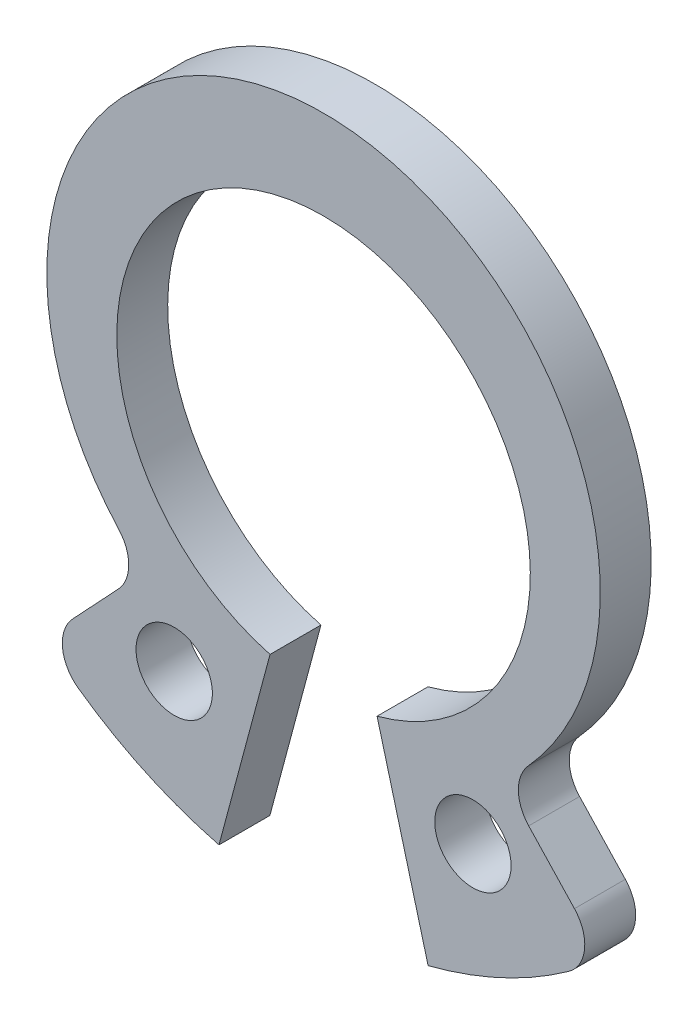
ISO-10303-21;
HEADER;
FILE_DESCRIPTION(('STEP AP214'),'2;1');
FILE_NAME('part.step','',(''),(''),'','','');
FILE_SCHEMA(('AUTOMOTIVE_DESIGN { 1 0 10303 214 1 1 1 1 }'));
ENDSEC;
DATA;
#1=APPLICATION_CONTEXT('core data for automotive mechanical design processes');
#2=APPLICATION_PROTOCOL_DEFINITION('international standard','automotive_design',2000,#1);
#3=PRODUCT_CONTEXT('',#1,'mechanical');
#4=PRODUCT('Part','Part','',(#3));
#5=PRODUCT_RELATED_PRODUCT_CATEGORY('part','',(#4));
#6=PRODUCT_DEFINITION_FORMATION('','',#4);
#7=PRODUCT_DEFINITION_CONTEXT('part definition',#1,'design');
#8=PRODUCT_DEFINITION('design','',#6,#7);
#9=PRODUCT_DEFINITION_SHAPE('','',#8);
#10=(LENGTH_UNIT() NAMED_UNIT(*) SI_UNIT(.MILLI.,.METRE.));
#11=(NAMED_UNIT(*) PLANE_ANGLE_UNIT() SI_UNIT($,.RADIAN.));
#12=(NAMED_UNIT(*) SI_UNIT($,.STERADIAN.) SOLID_ANGLE_UNIT());
#13=UNCERTAINTY_MEASURE_WITH_UNIT(LENGTH_MEASURE(1.E-05),#10,'distance_accuracy_value','');
#14=(GEOMETRIC_REPRESENTATION_CONTEXT(3) GLOBAL_UNCERTAINTY_ASSIGNED_CONTEXT((#13)) GLOBAL_UNIT_ASSIGNED_CONTEXT((#10,
#11,#12)) REPRESENTATION_CONTEXT('',''));
#15=CARTESIAN_POINT('',(0.,0.,0.));
#16=DIRECTION('',(0.,0.,1.));
#17=DIRECTION('',(1.,0.,0.));
#18=AXIS2_PLACEMENT_3D('',#15,#16,#17);
#19=CARTESIAN_POINT('',(-3.66231986137294,-3.03015213361091,0.799999999999999));
#20=DIRECTION('',(0.,0.,-1.));
#21=DIRECTION('',(-1.,0.,0.));
#22=AXIS2_PLACEMENT_3D('',#19,#20,#21);
#23=PLANE('',#22);
#24=CARTESIAN_POINT('',(2.34784131169638,-4.12311552116799,0.799999999999999));
#25=DIRECTION('',(0.,0.,1.));
#26=DIRECTION('',(1.,0.,0.));
#27=AXIS2_PLACEMENT_3D('',#24,#25,#26);
#28=CIRCLE('',#27,0.6);
#29=CARTESIAN_POINT('',(2.94784131169638,-4.12311552116799,0.799999999999999));
#30=VERTEX_POINT('',#29);
#31=EDGE_CURVE('E164',#30,#30,#28,.T.);
#32=ORIENTED_EDGE('',*,*,#31,.F.);
#33=EDGE_LOOP('',(#32));
#34=FACE_BOUND('',#33,.T.);
#35=CARTESIAN_POINT('',(-3.66231986137294,-3.03015213361091,0.799999999999999));
#36=DIRECTION('',(0.,0.,-1.));
#37=DIRECTION('',(-1.,0.,0.));
#38=AXIS2_PLACEMENT_3D('',#35,#36,#37);
#39=CIRCLE('',#38,0.600000000000001);
#40=CARTESIAN_POINT('',(-3.21840230241865,-2.62649732953685,0.799999999999999));
#41=VERTEX_POINT('',#40);
#42=CARTESIAN_POINT('',(-3.22454122978115,-3.44045673963138,0.799999999999999));
#43=VERTEX_POINT('',#42);
#44=EDGE_CURVE('E183',#41,#43,#39,.T.);
#45=ORIENTED_EDGE('',*,*,#44,.T.);
#46=DIRECTION('',(-0.683841010034117,-0.729631052652996,0.));
#47=VECTOR('',#46,1.);
#48=CARTESIAN_POINT('',(-3.22454122978115,-3.44045673963138,0.799999999999999));
#49=LINE('',#48,#47);
#50=CARTESIAN_POINT('',(-3.94401144754093,-4.20810273429081,0.799999999999999));
#51=VERTEX_POINT('',#50);
#52=EDGE_CURVE('E111',#43,#51,#49,.T.);
#53=ORIENTED_EDGE('',*,*,#52,.T.);
#54=CARTESIAN_POINT('',(-3.50623281594913,-4.61840734031128,0.799999999999999));
#55=DIRECTION('',(0.,0.,1.));
#56=DIRECTION('',(-1.,0.,0.));
#57=AXIS2_PLACEMENT_3D('',#54,#55,#56);
#58=CIRCLE('',#57,0.599999999999999);
#59=CARTESIAN_POINT('',(-3.85452072680957,-5.10697210689651,0.799999999999999));
#60=VERTEX_POINT('',#59);
#61=EDGE_CURVE('E210',#51,#60,#58,.T.);
#62=ORIENTED_EDGE('',*,*,#61,.T.);
#63=CARTESIAN_POINT('',(0.,0.300000000000002,0.799999999999999));
#64=DIRECTION('',(0.,0.,1.));
#65=DIRECTION('',(1.,0.,0.));
#66=AXIS2_PLACEMENT_3D('',#63,#64,#65);
#67=CIRCLE('',#66,6.64023172774575);
#68=CARTESIAN_POINT('',(-1.643500936401,-6.13362899693558,0.799999999999999));
#69=VERTEX_POINT('',#68);
#70=EDGE_CURVE('E229',#60,#69,#67,.T.);
#71=ORIENTED_EDGE('',*,*,#70,.T.);
#72=DIRECTION('',(0.258819045102521,0.965925826289068,0.));
#73=VECTOR('',#72,1.);
#74=CARTESIAN_POINT('',(-0.84116189658319,-3.13925893543947,0.799999999999999));
#75=LINE('',#74,#73);
#76=CARTESIAN_POINT('',(-0.84116189658319,-3.13925893543947,0.799999999999999));
#77=VERTEX_POINT('',#76);
#78=EDGE_CURVE('E226',#69,#77,#75,.T.);
#79=ORIENTED_EDGE('',*,*,#78,.T.);
#80=CARTESIAN_POINT('',(0.,0.,0.799999999999999));
#81=DIRECTION('',(0.,0.,-1.));
#82=DIRECTION('',(1.,0.,0.));
#83=AXIS2_PLACEMENT_3D('',#80,#81,#82);
#84=CIRCLE('',#83,3.25);
#85=CARTESIAN_POINT('',(0.84116189658319,-3.13925893543947,0.799999999999999));
#86=VERTEX_POINT('',#85);
#87=EDGE_CURVE('E228',#77,#86,#84,.T.);
#88=ORIENTED_EDGE('',*,*,#87,.T.);
#89=DIRECTION('',(0.258819045102521,-0.965925826289068,0.));
#90=VECTOR('',#89,1.);
#91=CARTESIAN_POINT('',(0.84116189658319,-3.13925893543947,0.799999999999999));
#92=LINE('',#91,#90);
#93=CARTESIAN_POINT('',(1.643500936401,-6.13362899693558,0.799999999999999));
#94=VERTEX_POINT('',#93);
#95=EDGE_CURVE('E231',#86,#94,#92,.T.);
#96=ORIENTED_EDGE('',*,*,#95,.T.);
#97=CARTESIAN_POINT('',(0.,0.300000000000002,0.799999999999999));
#98=DIRECTION('',(0.,0.,1.));
#99=DIRECTION('',(1.,0.,0.));
#100=AXIS2_PLACEMENT_3D('',#97,#98,#99);
#101=CIRCLE('',#100,6.64023172774575);
#102=CARTESIAN_POINT('',(3.85452072680957,-5.10697210689651,0.799999999999999));
#103=VERTEX_POINT('',#102);
#104=EDGE_CURVE('E237',#94,#103,#101,.T.);
#105=ORIENTED_EDGE('',*,*,#104,.T.);
#106=CARTESIAN_POINT('',(3.50623281594913,-4.61840734031128,0.799999999999999));
#107=DIRECTION('',(0.,0.,1.));
#108=DIRECTION('',(1.,0.,0.));
#109=AXIS2_PLACEMENT_3D('',#106,#107,#108);
#110=CIRCLE('',#109,0.599999999999999);
#111=CARTESIAN_POINT('',(3.94401144754093,-4.20810273429081,0.799999999999999));
#112=VERTEX_POINT('',#111);
#113=EDGE_CURVE('E142',#103,#112,#110,.T.);
#114=ORIENTED_EDGE('',*,*,#113,.T.);
#115=DIRECTION('',(-0.683841010034117,0.729631052652996,0.));
#116=VECTOR('',#115,1.);
#117=CARTESIAN_POINT('',(3.22454122978115,-3.44045673963138,0.799999999999999));
#118=LINE('',#117,#116);
#119=CARTESIAN_POINT('',(3.22454122978115,-3.44045673963138,0.799999999999999));
#120=VERTEX_POINT('',#119);
#121=EDGE_CURVE('E136',#112,#120,#118,.T.);
#122=ORIENTED_EDGE('',*,*,#121,.T.);
#123=CARTESIAN_POINT('',(3.66231986137294,-3.03015213361091,0.799999999999999));
#124=DIRECTION('',(0.,0.,-1.));
#125=DIRECTION('',(1.,0.,0.));
#126=AXIS2_PLACEMENT_3D('',#123,#124,#125);
#127=CIRCLE('',#126,0.600000000000001);
#128=CARTESIAN_POINT('',(3.21840230241864,-2.62649732953686,0.799999999999999));
#129=VERTEX_POINT('',#128);
#130=EDGE_CURVE('E140',#120,#129,#127,.T.);
#131=ORIENTED_EDGE('',*,*,#130,.T.);
#132=CARTESIAN_POINT('',(0.,0.300000000000002,0.799999999999999));
#133=DIRECTION('',(0.,0.,1.));
#134=DIRECTION('',(1.,0.,0.));
#135=AXIS2_PLACEMENT_3D('',#132,#133,#134);
#136=CIRCLE('',#135,4.35);
#137=EDGE_CURVE('E56',#129,#41,#136,.T.);
#138=ORIENTED_EDGE('',*,*,#137,.T.);
#139=EDGE_LOOP('',(#45,#53,#62,#71,#79,#88,#96,#105,#114,#122,#131,#138));
#140=FACE_BOUND('',#139,.T.);
#141=CARTESIAN_POINT('',(-2.34784131169638,-4.12311552116799,0.799999999999999));
#142=DIRECTION('',(0.,0.,1.));
#143=DIRECTION('',(-1.,0.,0.));
#144=AXIS2_PLACEMENT_3D('',#141,#142,#143);
#145=CIRCLE('',#144,0.6);
#146=CARTESIAN_POINT('',(-2.94784131169638,-4.12311552116799,0.799999999999999));
#147=VERTEX_POINT('',#146);
#148=EDGE_CURVE('E280',#147,#147,#145,.T.);
#149=ORIENTED_EDGE('',*,*,#148,.F.);
#150=EDGE_LOOP('',(#149));
#151=FACE_BOUND('',#150,.T.);
#152=ADVANCED_FACE('F39',(#34,#140,#151),#23,.F.);
#153=CARTESIAN_POINT('',(-3.66231986137294,-3.03015213361091,0.));
#154=DIRECTION('',(0.,0.,-1.));
#155=DIRECTION('',(-1.,0.,0.));
#156=AXIS2_PLACEMENT_3D('',#153,#154,#155);
#157=PLANE('',#156);
#158=CARTESIAN_POINT('',(2.34784131169638,-4.12311552116799,0.));
#159=DIRECTION('',(0.,0.,1.));
#160=DIRECTION('',(1.,0.,0.));
#161=AXIS2_PLACEMENT_3D('',#158,#159,#160);
#162=CIRCLE('',#161,0.6);
#163=CARTESIAN_POINT('',(2.94784131169638,-4.12311552116799,0.));
#164=VERTEX_POINT('',#163);
#165=EDGE_CURVE('E285',#164,#164,#162,.T.);
#166=ORIENTED_EDGE('',*,*,#165,.T.);
#167=EDGE_LOOP('',(#166));
#168=FACE_BOUND('',#167,.T.);
#169=CARTESIAN_POINT('',(-3.66231986137294,-3.03015213361091,0.));
#170=DIRECTION('',(0.,0.,-1.));
#171=DIRECTION('',(-1.,0.,0.));
#172=AXIS2_PLACEMENT_3D('',#169,#170,#171);
#173=CIRCLE('',#172,0.600000000000001);
#174=CARTESIAN_POINT('',(-3.21840230241865,-2.62649732953685,0.));
#175=VERTEX_POINT('',#174);
#176=CARTESIAN_POINT('',(-3.22454122978115,-3.44045673963138,0.));
#177=VERTEX_POINT('',#176);
#178=EDGE_CURVE('E160',#175,#177,#173,.T.);
#179=ORIENTED_EDGE('',*,*,#178,.F.);
#180=CARTESIAN_POINT('',(0.,0.300000000000002,0.));
#181=DIRECTION('',(0.,0.,1.));
#182=DIRECTION('',(1.,0.,0.));
#183=AXIS2_PLACEMENT_3D('',#180,#181,#182);
#184=CIRCLE('',#183,4.35);
#185=CARTESIAN_POINT('',(3.21840230241864,-2.62649732953686,0.));
#186=VERTEX_POINT('',#185);
#187=EDGE_CURVE('E103',#186,#175,#184,.T.);
#188=ORIENTED_EDGE('',*,*,#187,.F.);
#189=CARTESIAN_POINT('',(3.66231986137294,-3.03015213361091,0.));
#190=DIRECTION('',(0.,0.,-1.));
#191=DIRECTION('',(1.,0.,0.));
#192=AXIS2_PLACEMENT_3D('',#189,#190,#191);
#193=CIRCLE('',#192,0.600000000000001);
#194=CARTESIAN_POINT('',(3.22454122978115,-3.44045673963138,0.));
#195=VERTEX_POINT('',#194);
#196=EDGE_CURVE('E97',#195,#186,#193,.T.);
#197=ORIENTED_EDGE('',*,*,#196,.F.);
#198=DIRECTION('',(-0.683841010034117,0.729631052652996,0.));
#199=VECTOR('',#198,1.);
#200=CARTESIAN_POINT('',(3.22454122978115,-3.44045673963138,0.));
#201=LINE('',#200,#199);
#202=CARTESIAN_POINT('',(3.94401144754093,-4.20810273429081,0.));
#203=VERTEX_POINT('',#202);
#204=EDGE_CURVE('E150',#203,#195,#201,.T.);
#205=ORIENTED_EDGE('',*,*,#204,.F.);
#206=CARTESIAN_POINT('',(3.50623281594913,-4.61840734031128,0.));
#207=DIRECTION('',(0.,0.,1.));
#208=DIRECTION('',(1.,0.,0.));
#209=AXIS2_PLACEMENT_3D('',#206,#207,#208);
#210=CIRCLE('',#209,0.599999999999999);
#211=CARTESIAN_POINT('',(3.85452072680957,-5.10697210689651,0.));
#212=VERTEX_POINT('',#211);
#213=EDGE_CURVE('E178',#212,#203,#210,.T.);
#214=ORIENTED_EDGE('',*,*,#213,.F.);
#215=CARTESIAN_POINT('',(0.,0.300000000000002,0.));
#216=DIRECTION('',(0.,0.,1.));
#217=DIRECTION('',(1.,0.,0.));
#218=AXIS2_PLACEMENT_3D('',#215,#216,#217);
#219=CIRCLE('',#218,6.64023172774575);
#220=CARTESIAN_POINT('',(1.643500936401,-6.13362899693558,0.));
#221=VERTEX_POINT('',#220);
#222=EDGE_CURVE('E176',#221,#212,#219,.T.);
#223=ORIENTED_EDGE('',*,*,#222,.F.);
#224=DIRECTION('',(0.258819045102521,-0.965925826289068,0.));
#225=VECTOR('',#224,1.);
#226=CARTESIAN_POINT('',(0.84116189658319,-3.13925893543947,0.));
#227=LINE('',#226,#225);
#228=CARTESIAN_POINT('',(0.84116189658319,-3.13925893543947,0.));
#229=VERTEX_POINT('',#228);
#230=EDGE_CURVE('E174',#229,#221,#227,.T.);
#231=ORIENTED_EDGE('',*,*,#230,.F.);
#232=CARTESIAN_POINT('',(0.,0.,0.));
#233=DIRECTION('',(0.,0.,-1.));
#234=DIRECTION('',(1.,0.,0.));
#235=AXIS2_PLACEMENT_3D('',#232,#233,#234);
#236=CIRCLE('',#235,3.25);
#237=CARTESIAN_POINT('',(-0.84116189658319,-3.13925893543947,0.));
#238=VERTEX_POINT('',#237);
#239=EDGE_CURVE('E172',#238,#229,#236,.T.);
#240=ORIENTED_EDGE('',*,*,#239,.F.);
#241=DIRECTION('',(0.258819045102521,0.965925826289068,0.));
#242=VECTOR('',#241,1.);
#243=CARTESIAN_POINT('',(-0.84116189658319,-3.13925893543947,0.));
#244=LINE('',#243,#242);
#245=CARTESIAN_POINT('',(-1.643500936401,-6.13362899693558,0.));
#246=VERTEX_POINT('',#245);
#247=EDGE_CURVE('E170',#246,#238,#244,.T.);
#248=ORIENTED_EDGE('',*,*,#247,.F.);
#249=CARTESIAN_POINT('',(0.,0.300000000000002,0.));
#250=DIRECTION('',(0.,0.,1.));
#251=DIRECTION('',(1.,0.,0.));
#252=AXIS2_PLACEMENT_3D('',#249,#250,#251);
#253=CIRCLE('',#252,6.64023172774575);
#254=CARTESIAN_POINT('',(-3.85452072680957,-5.10697210689651,0.));
#255=VERTEX_POINT('',#254);
#256=EDGE_CURVE('E168',#255,#246,#253,.T.);
#257=ORIENTED_EDGE('',*,*,#256,.F.);
#258=CARTESIAN_POINT('',(-3.50623281594913,-4.61840734031128,0.));
#259=DIRECTION('',(0.,0.,1.));
#260=DIRECTION('',(-1.,0.,0.));
#261=AXIS2_PLACEMENT_3D('',#258,#259,#260);
#262=CIRCLE('',#261,0.599999999999999);
#263=CARTESIAN_POINT('',(-3.94401144754093,-4.20810273429081,0.));
#264=VERTEX_POINT('',#263);
#265=EDGE_CURVE('E166',#264,#255,#262,.T.);
#266=ORIENTED_EDGE('',*,*,#265,.F.);
#267=DIRECTION('',(-0.683841010034117,-0.729631052652996,0.));
#268=VECTOR('',#267,1.);
#269=CARTESIAN_POINT('',(-3.22454122978115,-3.44045673963138,0.));
#270=LINE('',#269,#268);
#271=EDGE_CURVE('E163',#177,#264,#270,.T.);
#272=ORIENTED_EDGE('',*,*,#271,.F.);
#273=EDGE_LOOP('',(#179,#188,#197,#205,#214,#223,#231,#240,#248,#257,#266,#272));
#274=FACE_BOUND('',#273,.T.);
#275=CARTESIAN_POINT('',(-2.34784131169638,-4.12311552116799,0.));
#276=DIRECTION('',(0.,0.,1.));
#277=DIRECTION('',(-1.,0.,0.));
#278=AXIS2_PLACEMENT_3D('',#275,#276,#277);
#279=CIRCLE('',#278,0.6);
#280=CARTESIAN_POINT('',(-2.94784131169638,-4.12311552116799,0.));
#281=VERTEX_POINT('',#280);
#282=EDGE_CURVE('E283',#281,#281,#279,.T.);
#283=ORIENTED_EDGE('',*,*,#282,.T.);
#284=EDGE_LOOP('',(#283));
#285=FACE_BOUND('',#284,.T.);
#286=ADVANCED_FACE('F214',(#168,#274,#285),#157,.T.);
#287=CARTESIAN_POINT('',(-3.66231986137294,-3.03015213361091,0.799999999999999));
#288=DIRECTION('',(0.,0.,-1.));
#289=DIRECTION('',(-1.,0.,0.));
#290=AXIS2_PLACEMENT_3D('',#287,#288,#289);
#291=CYLINDRICAL_SURFACE('',#290,0.600000000000001);
#292=ORIENTED_EDGE('',*,*,#178,.T.);
#293=DIRECTION('',(0.,0.,-1.));
#294=VECTOR('',#293,1.);
#295=CARTESIAN_POINT('',(-3.22454122978115,-3.44045673963138,0.799999999999999));
#296=LINE('',#295,#294);
#297=EDGE_CURVE('E13',#43,#177,#296,.T.);
#298=ORIENTED_EDGE('',*,*,#297,.F.);
#299=ORIENTED_EDGE('',*,*,#44,.F.);
#300=DIRECTION('',(0.,0.,-1.));
#301=VECTOR('',#300,1.);
#302=CARTESIAN_POINT('',(-3.21840230241865,-2.62649732953685,0.799999999999999));
#303=LINE('',#302,#301);
#304=EDGE_CURVE('E156',#41,#175,#303,.T.);
#305=ORIENTED_EDGE('',*,*,#304,.T.);
#306=EDGE_LOOP('',(#292,#298,#299,#305));
#307=FACE_BOUND('',#306,.T.);
#308=ADVANCED_FACE('F41',(#307),#291,.F.);
#309=CARTESIAN_POINT('',(-3.22454122978115,-3.44045673963138,0.799999999999999));
#310=DIRECTION('',(0.729631052652996,-0.683841010034117,0.));
#311=DIRECTION('',(0.683841010034117,0.729631052652996,0.));
#312=AXIS2_PLACEMENT_3D('',#309,#310,#311);
#313=PLANE('',#312);
#314=ORIENTED_EDGE('',*,*,#271,.T.);
#315=DIRECTION('',(0.,0.,-1.));
#316=VECTOR('',#315,1.);
#317=CARTESIAN_POINT('',(-3.94401144754093,-4.20810273429081,0.799999999999999));
#318=LINE('',#317,#316);
#319=EDGE_CURVE('E48',#51,#264,#318,.T.);
#320=ORIENTED_EDGE('',*,*,#319,.F.);
#321=ORIENTED_EDGE('',*,*,#52,.F.);
#322=ORIENTED_EDGE('',*,*,#297,.T.);
#323=EDGE_LOOP('',(#314,#320,#321,#322));
#324=FACE_BOUND('',#323,.T.);
#325=ADVANCED_FACE('F358',(#324),#313,.F.);
#326=CARTESIAN_POINT('',(-3.50623281594913,-4.61840734031128,0.799999999999999));
#327=DIRECTION('',(0.,0.,-1.));
#328=DIRECTION('',(-1.,0.,0.));
#329=AXIS2_PLACEMENT_3D('',#326,#327,#328);
#330=CYLINDRICAL_SURFACE('',#329,0.599999999999999);
#331=ORIENTED_EDGE('',*,*,#265,.T.);
#332=DIRECTION('',(0.,0.,-1.));
#333=VECTOR('',#332,1.);
#334=CARTESIAN_POINT('',(-3.85452072680957,-5.10697210689651,0.799999999999999));
#335=LINE('',#334,#333);
#336=EDGE_CURVE('E202',#60,#255,#335,.T.);
#337=ORIENTED_EDGE('',*,*,#336,.F.);
#338=ORIENTED_EDGE('',*,*,#61,.F.);
#339=ORIENTED_EDGE('',*,*,#319,.T.);
#340=EDGE_LOOP('',(#331,#337,#338,#339));
#341=FACE_BOUND('',#340,.T.);
#342=ADVANCED_FACE('F208',(#341),#330,.T.);
#343=CARTESIAN_POINT('',(0.,0.300000000000002,0.799999999999999));
#344=DIRECTION('',(0.,0.,-1.));
#345=DIRECTION('',(-1.,0.,0.));
#346=AXIS2_PLACEMENT_3D('',#343,#344,#345);
#347=CYLINDRICAL_SURFACE('',#346,6.64023172774575);
#348=ORIENTED_EDGE('',*,*,#256,.T.);
#349=DIRECTION('',(0.,0.,-1.));
#350=VECTOR('',#349,1.);
#351=CARTESIAN_POINT('',(-1.643500936401,-6.13362899693558,0.799999999999999));
#352=LINE('',#351,#350);
#353=EDGE_CURVE('E199',#69,#246,#352,.T.);
#354=ORIENTED_EDGE('',*,*,#353,.F.);
#355=ORIENTED_EDGE('',*,*,#70,.F.);
#356=ORIENTED_EDGE('',*,*,#336,.T.);
#357=EDGE_LOOP('',(#348,#354,#355,#356));
#358=FACE_BOUND('',#357,.T.);
#359=ADVANCED_FACE('F220',(#358),#347,.T.);
#360=CARTESIAN_POINT('',(-0.84116189658319,-3.13925893543947,0.799999999999999));
#361=DIRECTION('',(-0.965925826289068,0.258819045102521,0.));
#362=DIRECTION('',(-0.258819045102521,-0.965925826289068,0.));
#363=AXIS2_PLACEMENT_3D('',#360,#361,#362);
#364=PLANE('',#363);
#365=ORIENTED_EDGE('',*,*,#247,.T.);
#366=DIRECTION('',(0.,0.,-1.));
#367=VECTOR('',#366,1.);
#368=CARTESIAN_POINT('',(-0.84116189658319,-3.13925893543947,0.799999999999999));
#369=LINE('',#368,#367);
#370=EDGE_CURVE('E196',#77,#238,#369,.T.);
#371=ORIENTED_EDGE('',*,*,#370,.F.);
#372=ORIENTED_EDGE('',*,*,#78,.F.);
#373=ORIENTED_EDGE('',*,*,#353,.T.);
#374=EDGE_LOOP('',(#365,#371,#372,#373));
#375=FACE_BOUND('',#374,.T.);
#376=ADVANCED_FACE('F224',(#375),#364,.F.);
#377=CARTESIAN_POINT('',(0.,0.,0.799999999999999));
#378=DIRECTION('',(0.,0.,-1.));
#379=DIRECTION('',(-1.,0.,0.));
#380=AXIS2_PLACEMENT_3D('',#377,#378,#379);
#381=CYLINDRICAL_SURFACE('',#380,3.25);
#382=ORIENTED_EDGE('',*,*,#239,.T.);
#383=DIRECTION('',(0.,0.,-1.));
#384=VECTOR('',#383,1.);
#385=CARTESIAN_POINT('',(0.84116189658319,-3.13925893543947,0.799999999999999));
#386=LINE('',#385,#384);
#387=EDGE_CURVE('E193',#86,#229,#386,.T.);
#388=ORIENTED_EDGE('',*,*,#387,.F.);
#389=ORIENTED_EDGE('',*,*,#87,.F.);
#390=ORIENTED_EDGE('',*,*,#370,.T.);
#391=EDGE_LOOP('',(#382,#388,#389,#390));
#392=FACE_BOUND('',#391,.T.);
#393=ADVANCED_FACE('F331',(#392),#381,.F.);
#394=CARTESIAN_POINT('',(0.84116189658319,-3.13925893543947,0.799999999999999));
#395=DIRECTION('',(0.965925826289068,0.258819045102521,0.));
#396=DIRECTION('',(-0.258819045102521,0.965925826289068,0.));
#397=AXIS2_PLACEMENT_3D('',#394,#395,#396);
#398=PLANE('',#397);
#399=ORIENTED_EDGE('',*,*,#230,.T.);
#400=DIRECTION('',(0.,0.,-1.));
#401=VECTOR('',#400,1.);
#402=CARTESIAN_POINT('',(1.643500936401,-6.13362899693558,0.799999999999999));
#403=LINE('',#402,#401);
#404=EDGE_CURVE('E190',#94,#221,#403,.T.);
#405=ORIENTED_EDGE('',*,*,#404,.F.);
#406=ORIENTED_EDGE('',*,*,#95,.F.);
#407=ORIENTED_EDGE('',*,*,#387,.T.);
#408=EDGE_LOOP('',(#399,#405,#406,#407));
#409=FACE_BOUND('',#408,.T.);
#410=ADVANCED_FACE('F324',(#409),#398,.F.);
#411=CARTESIAN_POINT('',(0.,0.300000000000002,0.799999999999999));
#412=DIRECTION('',(0.,0.,-1.));
#413=DIRECTION('',(-1.,0.,0.));
#414=AXIS2_PLACEMENT_3D('',#411,#412,#413);
#415=CYLINDRICAL_SURFACE('',#414,6.64023172774575);
#416=ORIENTED_EDGE('',*,*,#222,.T.);
#417=DIRECTION('',(0.,0.,-1.));
#418=VECTOR('',#417,1.);
#419=CARTESIAN_POINT('',(3.85452072680957,-5.10697210689651,0.799999999999999));
#420=LINE('',#419,#418);
#421=EDGE_CURVE('E187',#103,#212,#420,.T.);
#422=ORIENTED_EDGE('',*,*,#421,.F.);
#423=ORIENTED_EDGE('',*,*,#104,.F.);
#424=ORIENTED_EDGE('',*,*,#404,.T.);
#425=EDGE_LOOP('',(#416,#422,#423,#424));
#426=FACE_BOUND('',#425,.T.);
#427=ADVANCED_FACE('F243',(#426),#415,.T.);
#428=CARTESIAN_POINT('',(3.50623281594913,-4.61840734031128,0.799999999999999));
#429=DIRECTION('',(0.,0.,-1.));
#430=DIRECTION('',(-1.,0.,0.));
#431=AXIS2_PLACEMENT_3D('',#428,#429,#430);
#432=CYLINDRICAL_SURFACE('',#431,0.599999999999999);
#433=ORIENTED_EDGE('',*,*,#213,.T.);
#434=DIRECTION('',(0.,0.,-1.));
#435=VECTOR('',#434,1.);
#436=CARTESIAN_POINT('',(3.94401144754093,-4.20810273429081,0.799999999999999));
#437=LINE('',#436,#435);
#438=EDGE_CURVE('E151',#112,#203,#437,.T.);
#439=ORIENTED_EDGE('',*,*,#438,.F.);
#440=ORIENTED_EDGE('',*,*,#113,.F.);
#441=ORIENTED_EDGE('',*,*,#421,.T.);
#442=EDGE_LOOP('',(#433,#439,#440,#441));
#443=FACE_BOUND('',#442,.T.);
#444=ADVANCED_FACE('F247',(#443),#432,.T.);
#445=CARTESIAN_POINT('',(3.22454122978115,-3.44045673963138,0.799999999999999));
#446=DIRECTION('',(-0.729631052652996,-0.683841010034117,0.));
#447=DIRECTION('',(0.683841010034117,-0.729631052652996,0.));
#448=AXIS2_PLACEMENT_3D('',#445,#446,#447);
#449=PLANE('',#448);
#450=ORIENTED_EDGE('',*,*,#204,.T.);
#451=DIRECTION('',(0.,0.,-1.));
#452=VECTOR('',#451,1.);
#453=CARTESIAN_POINT('',(3.22454122978115,-3.44045673963138,0.799999999999999));
#454=LINE('',#453,#452);
#455=EDGE_CURVE('E147',#120,#195,#454,.T.);
#456=ORIENTED_EDGE('',*,*,#455,.F.);
#457=ORIENTED_EDGE('',*,*,#121,.F.);
#458=ORIENTED_EDGE('',*,*,#438,.T.);
#459=EDGE_LOOP('',(#450,#456,#457,#458));
#460=FACE_BOUND('',#459,.T.);
#461=ADVANCED_FACE('F148',(#460),#449,.F.);
#462=CARTESIAN_POINT('',(3.66231986137294,-3.03015213361091,0.799999999999999));
#463=DIRECTION('',(0.,0.,-1.));
#464=DIRECTION('',(-1.,0.,0.));
#465=AXIS2_PLACEMENT_3D('',#462,#463,#464);
#466=CYLINDRICAL_SURFACE('',#465,0.600000000000001);
#467=ORIENTED_EDGE('',*,*,#196,.T.);
#468=DIRECTION('',(0.,0.,-1.));
#469=VECTOR('',#468,1.);
#470=CARTESIAN_POINT('',(3.21840230241864,-2.62649732953686,0.799999999999999));
#471=LINE('',#470,#469);
#472=EDGE_CURVE('E152',#129,#186,#471,.T.);
#473=ORIENTED_EDGE('',*,*,#472,.F.);
#474=ORIENTED_EDGE('',*,*,#130,.F.);
#475=ORIENTED_EDGE('',*,*,#455,.T.);
#476=EDGE_LOOP('',(#467,#473,#474,#475));
#477=FACE_BOUND('',#476,.T.);
#478=ADVANCED_FACE('F154',(#477),#466,.F.);
#479=CARTESIAN_POINT('',(0.,0.300000000000002,0.799999999999999));
#480=DIRECTION('',(0.,0.,-1.));
#481=DIRECTION('',(-1.,0.,0.));
#482=AXIS2_PLACEMENT_3D('',#479,#480,#481);
#483=CYLINDRICAL_SURFACE('',#482,4.35);
#484=ORIENTED_EDGE('',*,*,#187,.T.);
#485=ORIENTED_EDGE('',*,*,#304,.F.);
#486=ORIENTED_EDGE('',*,*,#137,.F.);
#487=ORIENTED_EDGE('',*,*,#472,.T.);
#488=EDGE_LOOP('',(#484,#485,#486,#487));
#489=FACE_BOUND('',#488,.T.);
#490=ADVANCED_FACE('F251',(#489),#483,.T.);
#491=CARTESIAN_POINT('',(2.34784131169638,-4.12311552116799,0.799999999999999));
#492=DIRECTION('',(0.,0.,-1.));
#493=DIRECTION('',(-1.,0.,0.));
#494=AXIS2_PLACEMENT_3D('',#491,#492,#493);
#495=CYLINDRICAL_SURFACE('',#494,0.6);
#496=ORIENTED_EDGE('',*,*,#31,.T.);
#497=EDGE_LOOP('',(#496));
#498=FACE_BOUND('',#497,.T.);
#499=ORIENTED_EDGE('',*,*,#165,.F.);
#500=EDGE_LOOP('',(#499));
#501=FACE_BOUND('',#500,.T.);
#502=ADVANCED_FACE('F253',(#498,#501),#495,.F.);
#503=CARTESIAN_POINT('',(-2.34784131169638,-4.12311552116799,0.799999999999999));
#504=DIRECTION('',(0.,0.,-1.));
#505=DIRECTION('',(-1.,0.,0.));
#506=AXIS2_PLACEMENT_3D('',#503,#504,#505);
#507=CYLINDRICAL_SURFACE('',#506,0.6);
#508=ORIENTED_EDGE('',*,*,#148,.T.);
#509=EDGE_LOOP('',(#508));
#510=FACE_BOUND('',#509,.T.);
#511=ORIENTED_EDGE('',*,*,#282,.F.);
#512=EDGE_LOOP('',(#511));
#513=FACE_BOUND('',#512,.T.);
#514=ADVANCED_FACE('F259',(#510,#513),#507,.F.);
#515=CLOSED_SHELL('',(#152,#286,#308,#325,#342,#359,#376,#393,#410,#427,#444,#461,#478,#490,
#502,#514));
#516=MANIFOLD_SOLID_BREP('B2',#515);
#517=ADVANCED_BREP_SHAPE_REPRESENTATION('',(#18,#516),#14);
#518=SHAPE_DEFINITION_REPRESENTATION(#9,#517);
ENDSEC;
END-ISO-10303-21;
